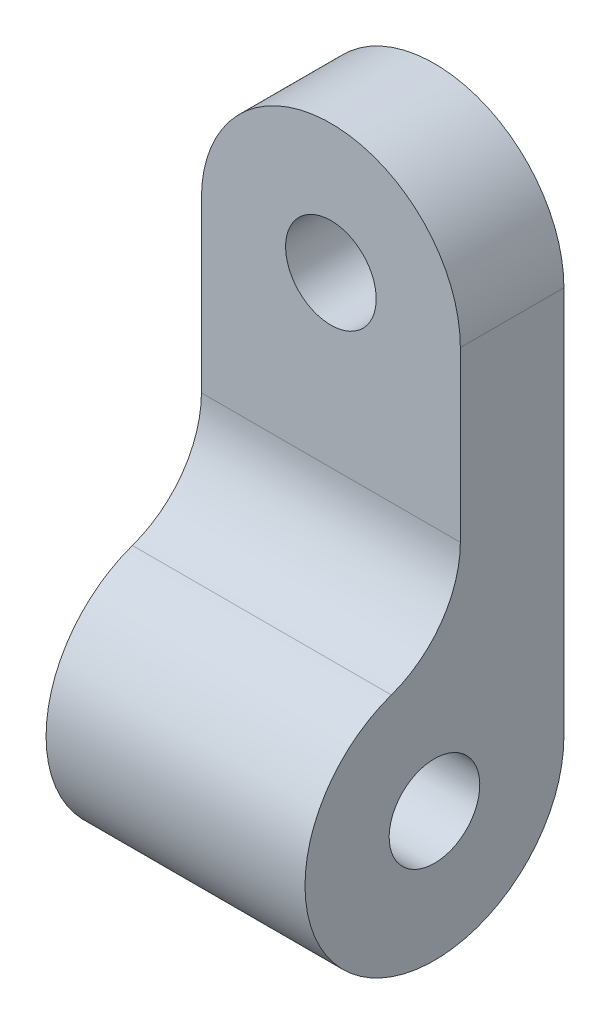
ISO-10303-21;
HEADER;
FILE_DESCRIPTION(('STEP AP214'),'2;1');
FILE_NAME('part.step','',(''),(''),'','','');
FILE_SCHEMA(('AUTOMOTIVE_DESIGN { 1 0 10303 214 1 1 1 1 }'));
ENDSEC;
DATA;
#1=APPLICATION_CONTEXT('core data for automotive mechanical design processes');
#2=APPLICATION_PROTOCOL_DEFINITION('international standard','automotive_design',2000,#1);
#3=PRODUCT_CONTEXT('',#1,'mechanical');
#4=PRODUCT('Part','Part','',(#3));
#5=PRODUCT_RELATED_PRODUCT_CATEGORY('part','',(#4));
#6=PRODUCT_DEFINITION_FORMATION('','',#4);
#7=PRODUCT_DEFINITION_CONTEXT('part definition',#1,'design');
#8=PRODUCT_DEFINITION('design','',#6,#7);
#9=PRODUCT_DEFINITION_SHAPE('','',#8);
#10=(LENGTH_UNIT() NAMED_UNIT(*) SI_UNIT(.MILLI.,.METRE.));
#11=(NAMED_UNIT(*) PLANE_ANGLE_UNIT() SI_UNIT($,.RADIAN.));
#12=(NAMED_UNIT(*) SI_UNIT($,.STERADIAN.) SOLID_ANGLE_UNIT());
#13=UNCERTAINTY_MEASURE_WITH_UNIT(LENGTH_MEASURE(1.E-05),#10,'distance_accuracy_value','');
#14=(GEOMETRIC_REPRESENTATION_CONTEXT(3) GLOBAL_UNCERTAINTY_ASSIGNED_CONTEXT((#13)) GLOBAL_UNIT_ASSIGNED_CONTEXT((#10,
#11,#12)) REPRESENTATION_CONTEXT('',''));
#15=CARTESIAN_POINT('',(0.,0.,0.));
#16=DIRECTION('',(0.,0.,1.));
#17=DIRECTION('',(1.,0.,0.));
#18=AXIS2_PLACEMENT_3D('',#15,#16,#17);
#19=CARTESIAN_POINT('',(-5.,0.,10.));
#20=DIRECTION('',(1.,0.,0.));
#21=DIRECTION('',(0.,1.,0.));
#22=AXIS2_PLACEMENT_3D('',#19,#20,#21);
#23=PLANE('',#22);
#24=CARTESIAN_POINT('',(-5.,-15.,5.));
#25=DIRECTION('',(-1.,0.,0.));
#26=DIRECTION('',(0.,-1.,0.));
#27=AXIS2_PLACEMENT_3D('',#24,#25,#26);
#28=CIRCLE('',#27,1.75);
#29=CARTESIAN_POINT('',(-5.,-16.75,5.));
#30=VERTEX_POINT('',#29);
#31=EDGE_CURVE('E234',#30,#30,#28,.T.);
#32=ORIENTED_EDGE('',*,*,#31,.F.);
#33=EDGE_LOOP('',(#32));
#34=FACE_BOUND('',#33,.T.);
#35=DIRECTION('',(0.,-1.,0.));
#36=VECTOR('',#35,1.);
#37=CARTESIAN_POINT('',(-5.,0.,0.));
#38=LINE('',#37,#36);
#39=CARTESIAN_POINT('',(-5.,0.,0.));
#40=VERTEX_POINT('',#39);
#41=CARTESIAN_POINT('',(-5.,-15.,0.));
#42=VERTEX_POINT('',#41);
#43=EDGE_CURVE('E213',#40,#42,#38,.T.);
#44=ORIENTED_EDGE('',*,*,#43,.T.);
#45=CARTESIAN_POINT('',(-5.,-15.,5.));
#46=DIRECTION('',(-1.,0.,0.));
#47=DIRECTION('',(0.,-1.,0.));
#48=AXIS2_PLACEMENT_3D('',#45,#46,#47);
#49=CIRCLE('',#48,5.);
#50=CARTESIAN_POINT('',(-5.,-10.2859547920897,6.66666666666667));
#51=VERTEX_POINT('',#50);
#52=EDGE_CURVE('E201',#42,#51,#49,.T.);
#53=ORIENTED_EDGE('',*,*,#52,.T.);
#54=CARTESIAN_POINT('',(-5.,-6.51471862576143,8.));
#55=DIRECTION('',(-1.,0.,0.));
#56=DIRECTION('',(0.,-1.,0.));
#57=AXIS2_PLACEMENT_3D('',#54,#55,#56);
#58=CIRCLE('',#57,4.);
#59=CARTESIAN_POINT('',(-5.,-6.51471862576143,4.));
#60=VERTEX_POINT('',#59);
#61=EDGE_CURVE('E229',#60,#51,#58,.T.);
#62=ORIENTED_EDGE('',*,*,#61,.F.);
#63=DIRECTION('',(0.,-1.,0.));
#64=VECTOR('',#63,1.);
#65=CARTESIAN_POINT('',(-5.,0.,4.));
#66=LINE('',#65,#64);
#67=CARTESIAN_POINT('',(-5.,0.,4.));
#68=VERTEX_POINT('',#67);
#69=EDGE_CURVE('E205',#68,#60,#66,.T.);
#70=ORIENTED_EDGE('',*,*,#69,.F.);
#71=DIRECTION('',(0.,0.,-1.));
#72=VECTOR('',#71,1.);
#73=CARTESIAN_POINT('',(-5.,0.,10.));
#74=LINE('',#73,#72);
#75=EDGE_CURVE('E12',#68,#40,#74,.T.);
#76=ORIENTED_EDGE('',*,*,#75,.T.);
#77=EDGE_LOOP('',(#44,#53,#62,#70,#76));
#78=FACE_BOUND('',#77,.T.);
#79=ADVANCED_FACE('F142',(#34,#78),#23,.F.);
#80=CARTESIAN_POINT('',(5.,-20.,10.));
#81=DIRECTION('',(-1.,0.,0.));
#82=DIRECTION('',(0.,-1.,0.));
#83=AXIS2_PLACEMENT_3D('',#80,#81,#82);
#84=PLANE('',#83);
#85=CARTESIAN_POINT('',(5.,-15.,5.));
#86=DIRECTION('',(-1.,0.,0.));
#87=DIRECTION('',(0.,-1.,0.));
#88=AXIS2_PLACEMENT_3D('',#85,#86,#87);
#89=CIRCLE('',#88,1.75);
#90=CARTESIAN_POINT('',(5.,-16.75,5.));
#91=VERTEX_POINT('',#90);
#92=EDGE_CURVE('E206',#91,#91,#89,.T.);
#93=ORIENTED_EDGE('',*,*,#92,.T.);
#94=EDGE_LOOP('',(#93));
#95=FACE_BOUND('',#94,.T.);
#96=CARTESIAN_POINT('',(5.,-15.,5.));
#97=DIRECTION('',(-1.,0.,0.));
#98=DIRECTION('',(0.,-1.,0.));
#99=AXIS2_PLACEMENT_3D('',#96,#97,#98);
#100=CIRCLE('',#99,5.);
#101=CARTESIAN_POINT('',(5.,-15.,0.));
#102=VERTEX_POINT('',#101);
#103=CARTESIAN_POINT('',(5.,-10.2859547920897,6.66666666666667));
#104=VERTEX_POINT('',#103);
#105=EDGE_CURVE('E189',#102,#104,#100,.T.);
#106=ORIENTED_EDGE('',*,*,#105,.F.);
#107=DIRECTION('',(0.,1.,0.));
#108=VECTOR('',#107,1.);
#109=CARTESIAN_POINT('',(5.,-20.,0.));
#110=LINE('',#109,#108);
#111=CARTESIAN_POINT('',(5.,0.,0.));
#112=VERTEX_POINT('',#111);
#113=EDGE_CURVE('E166',#102,#112,#110,.T.);
#114=ORIENTED_EDGE('',*,*,#113,.T.);
#115=DIRECTION('',(0.,0.,-1.));
#116=VECTOR('',#115,1.);
#117=CARTESIAN_POINT('',(5.,0.,10.));
#118=LINE('',#117,#116);
#119=CARTESIAN_POINT('',(5.,0.,4.));
#120=VERTEX_POINT('',#119);
#121=EDGE_CURVE('E151',#120,#112,#118,.T.);
#122=ORIENTED_EDGE('',*,*,#121,.F.);
#123=DIRECTION('',(0.,-1.,0.));
#124=VECTOR('',#123,1.);
#125=CARTESIAN_POINT('',(5.,0.,4.));
#126=LINE('',#125,#124);
#127=CARTESIAN_POINT('',(5.,-6.51471862576143,4.));
#128=VERTEX_POINT('',#127);
#129=EDGE_CURVE('E228',#120,#128,#126,.T.);
#130=ORIENTED_EDGE('',*,*,#129,.T.);
#131=CARTESIAN_POINT('',(5.,-6.51471862576143,8.));
#132=DIRECTION('',(-1.,0.,0.));
#133=DIRECTION('',(0.,-1.,0.));
#134=AXIS2_PLACEMENT_3D('',#131,#132,#133);
#135=CIRCLE('',#134,4.);
#136=EDGE_CURVE('E193',#128,#104,#135,.T.);
#137=ORIENTED_EDGE('',*,*,#136,.T.);
#138=EDGE_LOOP('',(#106,#114,#122,#130,#137));
#139=FACE_BOUND('',#138,.T.);
#140=ADVANCED_FACE('F191',(#95,#139),#84,.F.);
#141=CARTESIAN_POINT('',(0.,0.,0.));
#142=DIRECTION('',(0.,0.,1.));
#143=DIRECTION('',(1.,0.,0.));
#144=AXIS2_PLACEMENT_3D('',#141,#142,#143);
#145=PLANE('',#144);
#146=ORIENTED_EDGE('',*,*,#113,.F.);
#147=DIRECTION('',(-1.,0.,0.));
#148=VECTOR('',#147,1.);
#149=CARTESIAN_POINT('',(5.,-15.,0.));
#150=LINE('',#149,#148);
#151=EDGE_CURVE('E198',#102,#42,#150,.T.);
#152=ORIENTED_EDGE('',*,*,#151,.T.);
#153=ORIENTED_EDGE('',*,*,#43,.F.);
#154=CARTESIAN_POINT('',(0.,0.,0.));
#155=DIRECTION('',(0.,0.,1.));
#156=DIRECTION('',(1.,0.,0.));
#157=AXIS2_PLACEMENT_3D('',#154,#155,#156);
#158=CIRCLE('',#157,5.);
#159=EDGE_CURVE('E212',#112,#40,#158,.T.);
#160=ORIENTED_EDGE('',*,*,#159,.F.);
#161=EDGE_LOOP('',(#146,#152,#153,#160));
#162=FACE_BOUND('',#161,.T.);
#163=CARTESIAN_POINT('',(0.,0.,0.));
#164=DIRECTION('',(0.,0.,1.));
#165=DIRECTION('',(1.,0.,0.));
#166=AXIS2_PLACEMENT_3D('',#163,#164,#165);
#167=CIRCLE('',#166,1.75);
#168=CARTESIAN_POINT('',(1.75,0.,0.));
#169=VERTEX_POINT('',#168);
#170=EDGE_CURVE('E219',#169,#169,#167,.T.);
#171=ORIENTED_EDGE('',*,*,#170,.T.);
#172=EDGE_LOOP('',(#171));
#173=FACE_BOUND('',#172,.T.);
#174=ADVANCED_FACE('F209',(#162,#173),#145,.F.);
#175=CARTESIAN_POINT('',(0.,0.,10.));
#176=DIRECTION('',(0.,0.,-1.));
#177=DIRECTION('',(-1.,0.,0.));
#178=AXIS2_PLACEMENT_3D('',#175,#176,#177);
#179=CYLINDRICAL_SURFACE('',#178,5.);
#180=CARTESIAN_POINT('',(0.,0.,4.));
#181=DIRECTION('',(0.,0.,-1.));
#182=DIRECTION('',(0.,1.,0.));
#183=AXIS2_PLACEMENT_3D('',#180,#181,#182);
#184=CIRCLE('',#183,5.);
#185=EDGE_CURVE('E222',#68,#120,#184,.T.);
#186=ORIENTED_EDGE('',*,*,#185,.T.);
#187=ORIENTED_EDGE('',*,*,#121,.T.);
#188=ORIENTED_EDGE('',*,*,#159,.T.);
#189=ORIENTED_EDGE('',*,*,#75,.F.);
#190=EDGE_LOOP('',(#186,#187,#188,#189));
#191=FACE_BOUND('',#190,.T.);
#192=ADVANCED_FACE('F144',(#191),#179,.T.);
#193=CARTESIAN_POINT('',(0.,0.,10.));
#194=DIRECTION('',(0.,0.,-1.));
#195=DIRECTION('',(-1.,0.,0.));
#196=AXIS2_PLACEMENT_3D('',#193,#194,#195);
#197=CYLINDRICAL_SURFACE('',#196,1.75);
#198=CARTESIAN_POINT('',(0.,0.,4.));
#199=DIRECTION('',(0.,0.,-1.));
#200=DIRECTION('',(0.,1.,0.));
#201=AXIS2_PLACEMENT_3D('',#198,#199,#200);
#202=CIRCLE('',#201,1.75);
#203=CARTESIAN_POINT('',(0.,1.75,4.));
#204=VERTEX_POINT('',#203);
#205=EDGE_CURVE('E146',#204,#204,#202,.T.);
#206=ORIENTED_EDGE('',*,*,#205,.F.);
#207=EDGE_LOOP('',(#206));
#208=FACE_BOUND('',#207,.T.);
#209=ORIENTED_EDGE('',*,*,#170,.F.);
#210=EDGE_LOOP('',(#209));
#211=FACE_BOUND('',#210,.T.);
#212=ADVANCED_FACE('F266',(#208,#211),#197,.F.);
#213=CARTESIAN_POINT('',(5.,0.,4.));
#214=DIRECTION('',(0.,0.,-1.));
#215=DIRECTION('',(0.,1.,0.));
#216=AXIS2_PLACEMENT_3D('',#213,#214,#215);
#217=PLANE('',#216);
#218=ORIENTED_EDGE('',*,*,#205,.T.);
#219=EDGE_LOOP('',(#218));
#220=FACE_BOUND('',#219,.T.);
#221=ORIENTED_EDGE('',*,*,#185,.F.);
#222=ORIENTED_EDGE('',*,*,#69,.T.);
#223=DIRECTION('',(-1.,0.,0.));
#224=VECTOR('',#223,1.);
#225=CARTESIAN_POINT('',(5.,-6.51471862576143,4.));
#226=LINE('',#225,#224);
#227=EDGE_CURVE('E195',#128,#60,#226,.T.);
#228=ORIENTED_EDGE('',*,*,#227,.F.);
#229=ORIENTED_EDGE('',*,*,#129,.F.);
#230=EDGE_LOOP('',(#221,#222,#228,#229));
#231=FACE_BOUND('',#230,.T.);
#232=ADVANCED_FACE('F256',(#220,#231),#217,.F.);
#233=CARTESIAN_POINT('',(5.,-15.,5.));
#234=DIRECTION('',(-1.,0.,0.));
#235=DIRECTION('',(0.,-1.,0.));
#236=AXIS2_PLACEMENT_3D('',#233,#234,#235);
#237=CYLINDRICAL_SURFACE('',#236,5.);
#238=ORIENTED_EDGE('',*,*,#52,.F.);
#239=ORIENTED_EDGE('',*,*,#151,.F.);
#240=ORIENTED_EDGE('',*,*,#105,.T.);
#241=DIRECTION('',(-1.,0.,0.));
#242=VECTOR('',#241,1.);
#243=CARTESIAN_POINT('',(5.,-10.2859547920897,6.66666666666667));
#244=LINE('',#243,#242);
#245=EDGE_CURVE('E158',#104,#51,#244,.T.);
#246=ORIENTED_EDGE('',*,*,#245,.T.);
#247=EDGE_LOOP('',(#238,#239,#240,#246));
#248=FACE_BOUND('',#247,.T.);
#249=ADVANCED_FACE('F199',(#248),#237,.T.);
#250=CARTESIAN_POINT('',(5.,-6.51471862576143,8.));
#251=DIRECTION('',(-1.,0.,0.));
#252=DIRECTION('',(0.,-1.,0.));
#253=AXIS2_PLACEMENT_3D('',#250,#251,#252);
#254=CYLINDRICAL_SURFACE('',#253,4.);
#255=ORIENTED_EDGE('',*,*,#61,.T.);
#256=ORIENTED_EDGE('',*,*,#245,.F.);
#257=ORIENTED_EDGE('',*,*,#136,.F.);
#258=ORIENTED_EDGE('',*,*,#227,.T.);
#259=EDGE_LOOP('',(#255,#256,#257,#258));
#260=FACE_BOUND('',#259,.T.);
#261=ADVANCED_FACE('F244',(#260),#254,.F.);
#262=CARTESIAN_POINT('',(5.,-15.,5.));
#263=DIRECTION('',(-1.,0.,0.));
#264=DIRECTION('',(0.,-1.,0.));
#265=AXIS2_PLACEMENT_3D('',#262,#263,#264);
#266=CYLINDRICAL_SURFACE('',#265,1.75);
#267=ORIENTED_EDGE('',*,*,#92,.F.);
#268=EDGE_LOOP('',(#267));
#269=FACE_BOUND('',#268,.T.);
#270=ORIENTED_EDGE('',*,*,#31,.T.);
#271=EDGE_LOOP('',(#270));
#272=FACE_BOUND('',#271,.T.);
#273=ADVANCED_FACE('F241',(#269,#272),#266,.F.);
#274=CLOSED_SHELL('',(#79,#140,#174,#192,#212,#232,#249,#261,#273));
#275=MANIFOLD_SOLID_BREP('B2',#274);
#276=ADVANCED_BREP_SHAPE_REPRESENTATION('',(#18,#275),#14);
#277=SHAPE_DEFINITION_REPRESENTATION(#9,#276);
ENDSEC;
END-ISO-10303-21;
